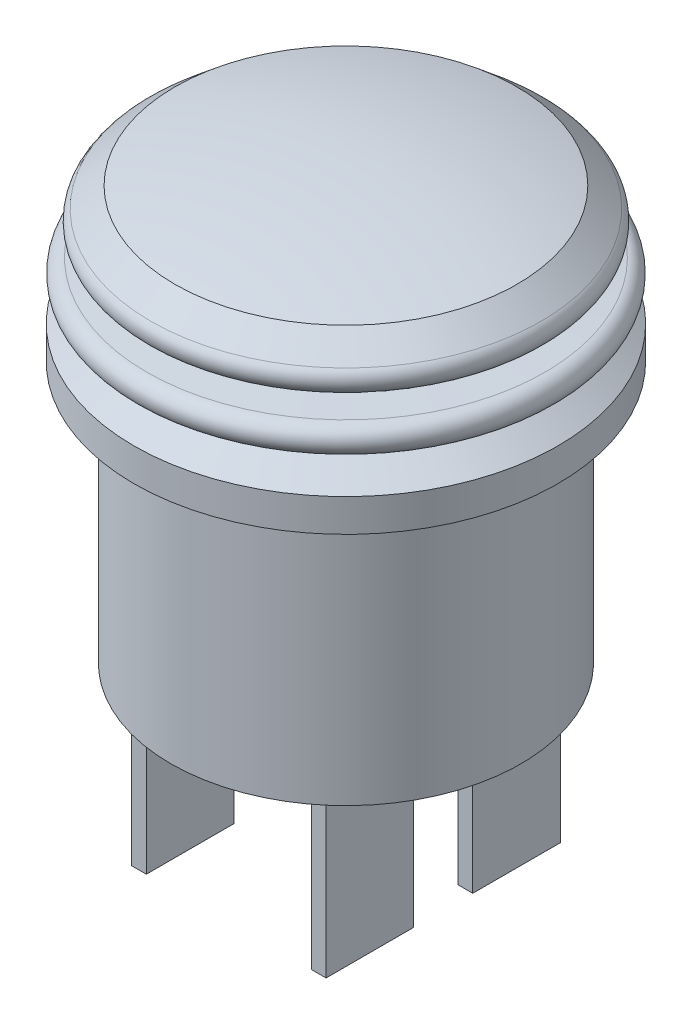
ISO-10303-21;
HEADER;
FILE_DESCRIPTION(('STEP AP214'),'2;1');
FILE_NAME('part.step','',(''),(''),'','','');
FILE_SCHEMA(('AUTOMOTIVE_DESIGN { 1 0 10303 214 1 1 1 1 }'));
ENDSEC;
DATA;
#1=APPLICATION_CONTEXT('core data for automotive mechanical design processes');
#2=APPLICATION_PROTOCOL_DEFINITION('international standard','automotive_design',2000,#1);
#3=PRODUCT_CONTEXT('',#1,'mechanical');
#4=PRODUCT('Part','Part','',(#3));
#5=PRODUCT_RELATED_PRODUCT_CATEGORY('part','',(#4));
#6=PRODUCT_DEFINITION_FORMATION('','',#4);
#7=PRODUCT_DEFINITION_CONTEXT('part definition',#1,'design');
#8=PRODUCT_DEFINITION('design','',#6,#7);
#9=PRODUCT_DEFINITION_SHAPE('','',#8);
#10=(LENGTH_UNIT() NAMED_UNIT(*) SI_UNIT(.MILLI.,.METRE.));
#11=(NAMED_UNIT(*) PLANE_ANGLE_UNIT() SI_UNIT($,.RADIAN.));
#12=(NAMED_UNIT(*) SI_UNIT($,.STERADIAN.) SOLID_ANGLE_UNIT());
#13=UNCERTAINTY_MEASURE_WITH_UNIT(LENGTH_MEASURE(1.E-05),#10,'distance_accuracy_value','');
#14=(GEOMETRIC_REPRESENTATION_CONTEXT(3) GLOBAL_UNCERTAINTY_ASSIGNED_CONTEXT((#13)) GLOBAL_UNIT_ASSIGNED_CONTEXT((#10,
#11,#12)) REPRESENTATION_CONTEXT('',''));
#15=CARTESIAN_POINT('',(0.,0.,0.));
#16=DIRECTION('',(0.,0.,1.));
#17=DIRECTION('',(1.,0.,0.));
#18=AXIS2_PLACEMENT_3D('',#15,#16,#17);
#19=CARTESIAN_POINT('',(0.,-13.2420041901718,0.));
#20=DIRECTION('',(0.,-1.,0.));
#21=DIRECTION('',(0.,0.,-1.));
#22=AXIS2_PLACEMENT_3D('',#19,#20,#21);
#23=PLANE('',#22);
#24=DIRECTION('',(-1.,0.,0.));
#25=VECTOR('',#24,1.);
#26=CARTESIAN_POINT('',(4.47592786310143,-13.2420041901718,-1.60451168270738));
#27=LINE('',#26,#25);
#28=CARTESIAN_POINT('',(5.27592786310143,-13.2420041901718,-1.60451168270738));
#29=VERTEX_POINT('',#28);
#30=CARTESIAN_POINT('',(4.47592786310143,-13.2420041901718,-1.60451168270738));
#31=VERTEX_POINT('',#30);
#32=EDGE_CURVE('E174',#29,#31,#27,.T.);
#33=ORIENTED_EDGE('',*,*,#32,.F.);
#34=DIRECTION('',(0.,0.,1.));
#35=VECTOR('',#34,1.);
#36=CARTESIAN_POINT('',(5.27592786310143,-13.2420041901718,-1.60451168270738));
#37=LINE('',#36,#35);
#38=CARTESIAN_POINT('',(5.27592786310143,-13.2420041901718,-6.35451168270738));
#39=VERTEX_POINT('',#38);
#40=EDGE_CURVE('E171',#39,#29,#37,.T.);
#41=ORIENTED_EDGE('',*,*,#40,.F.);
#42=DIRECTION('',(1.,0.,0.));
#43=VECTOR('',#42,1.);
#44=CARTESIAN_POINT('',(4.47592786310143,-13.2420041901718,-6.35451168270738));
#45=LINE('',#44,#43);
#46=CARTESIAN_POINT('',(4.47592786310143,-13.2420041901718,-6.35451168270738));
#47=VERTEX_POINT('',#46);
#48=EDGE_CURVE('E183',#47,#39,#45,.T.);
#49=ORIENTED_EDGE('',*,*,#48,.F.);
#50=DIRECTION('',(0.,0.,-1.));
#51=VECTOR('',#50,1.);
#52=CARTESIAN_POINT('',(4.47592786310143,-13.2420041901718,-1.60451168270738));
#53=LINE('',#52,#51);
#54=EDGE_CURVE('E191',#31,#47,#53,.T.);
#55=ORIENTED_EDGE('',*,*,#54,.F.);
#56=EDGE_LOOP('',(#33,#41,#49,#55));
#57=FACE_BOUND('',#56,.T.);
#58=DIRECTION('',(-1.,0.,0.));
#59=VECTOR('',#58,1.);
#60=CARTESIAN_POINT('',(-5.27592786310143,-13.2420041901718,6.35451168270738));
#61=LINE('',#60,#59);
#62=CARTESIAN_POINT('',(-4.47592786310143,-13.2420041901718,6.35451168270738));
#63=VERTEX_POINT('',#62);
#64=CARTESIAN_POINT('',(-5.27592786310143,-13.2420041901718,6.35451168270738));
#65=VERTEX_POINT('',#64);
#66=EDGE_CURVE('E245',#63,#65,#61,.T.);
#67=ORIENTED_EDGE('',*,*,#66,.F.);
#68=DIRECTION('',(0.,0.,1.));
#69=VECTOR('',#68,1.);
#70=CARTESIAN_POINT('',(-4.47592786310143,-13.2420041901718,6.35451168270738));
#71=LINE('',#70,#69);
#72=CARTESIAN_POINT('',(-4.47592786310143,-13.2420041901718,1.60451168270738));
#73=VERTEX_POINT('',#72);
#74=EDGE_CURVE('E231',#73,#63,#71,.T.);
#75=ORIENTED_EDGE('',*,*,#74,.F.);
#76=DIRECTION('',(1.,0.,0.));
#77=VECTOR('',#76,1.);
#78=CARTESIAN_POINT('',(-5.27592786310143,-13.2420041901718,1.60451168270738));
#79=LINE('',#78,#77);
#80=CARTESIAN_POINT('',(-5.27592786310143,-13.2420041901718,1.60451168270738));
#81=VERTEX_POINT('',#80);
#82=EDGE_CURVE('E236',#81,#73,#79,.T.);
#83=ORIENTED_EDGE('',*,*,#82,.F.);
#84=DIRECTION('',(0.,0.,-1.));
#85=VECTOR('',#84,1.);
#86=CARTESIAN_POINT('',(-5.27592786310143,-13.2420041901718,6.35451168270738));
#87=LINE('',#86,#85);
#88=EDGE_CURVE('E247',#65,#81,#87,.T.);
#89=ORIENTED_EDGE('',*,*,#88,.F.);
#90=EDGE_LOOP('',(#67,#75,#83,#89));
#91=FACE_BOUND('',#90,.T.);
#92=CARTESIAN_POINT('',(0.,-13.2420041901718,0.));
#93=DIRECTION('',(0.,1.,0.));
#94=DIRECTION('',(0.,0.,1.));
#95=AXIS2_PLACEMENT_3D('',#92,#93,#94);
#96=CIRCLE('',#95,9.49999999999999);
#97=CARTESIAN_POINT('',(0.,-13.2420041901718,9.49999999999999));
#98=VERTEX_POINT('',#97);
#99=EDGE_CURVE('E11',#98,#98,#96,.T.);
#100=ORIENTED_EDGE('',*,*,#99,.F.);
#101=EDGE_LOOP('',(#100));
#102=FACE_BOUND('',#101,.T.);
#103=DIRECTION('',(-1.,0.,0.));
#104=VECTOR('',#103,1.);
#105=CARTESIAN_POINT('',(4.47592786310143,-13.2420041901718,6.35451168270738));
#106=LINE('',#105,#104);
#107=CARTESIAN_POINT('',(5.27592786310143,-13.2420041901718,6.35451168270738));
#108=VERTEX_POINT('',#107);
#109=CARTESIAN_POINT('',(4.47592786310143,-13.2420041901718,6.35451168270738));
#110=VERTEX_POINT('',#109);
#111=EDGE_CURVE('E216',#108,#110,#106,.T.);
#112=ORIENTED_EDGE('',*,*,#111,.F.);
#113=DIRECTION('',(0.,0.,1.));
#114=VECTOR('',#113,1.);
#115=CARTESIAN_POINT('',(5.27592786310143,-13.2420041901718,6.35451168270738));
#116=LINE('',#115,#114);
#117=CARTESIAN_POINT('',(5.27592786310143,-13.2420041901718,1.60451168270738));
#118=VERTEX_POINT('',#117);
#119=EDGE_CURVE('E202',#118,#108,#116,.T.);
#120=ORIENTED_EDGE('',*,*,#119,.F.);
#121=DIRECTION('',(1.,0.,0.));
#122=VECTOR('',#121,1.);
#123=CARTESIAN_POINT('',(4.47592786310143,-13.2420041901718,1.60451168270738));
#124=LINE('',#123,#122);
#125=CARTESIAN_POINT('',(4.47592786310143,-13.2420041901718,1.60451168270738));
#126=VERTEX_POINT('',#125);
#127=EDGE_CURVE('E207',#126,#118,#124,.T.);
#128=ORIENTED_EDGE('',*,*,#127,.F.);
#129=DIRECTION('',(0.,0.,-1.));
#130=VECTOR('',#129,1.);
#131=CARTESIAN_POINT('',(4.47592786310143,-13.2420041901718,6.35451168270738));
#132=LINE('',#131,#130);
#133=EDGE_CURVE('E218',#110,#126,#132,.T.);
#134=ORIENTED_EDGE('',*,*,#133,.F.);
#135=EDGE_LOOP('',(#112,#120,#128,#134));
#136=FACE_BOUND('',#135,.T.);
#137=DIRECTION('',(-1.,0.,0.));
#138=VECTOR('',#137,1.);
#139=CARTESIAN_POINT('',(-5.27592786310143,-13.2420041901718,-1.60451168270737));
#140=LINE('',#139,#138);
#141=CARTESIAN_POINT('',(-4.47592786310143,-13.2420041901718,-1.60451168270737));
#142=VERTEX_POINT('',#141);
#143=CARTESIAN_POINT('',(-5.27592786310143,-13.2420041901718,-1.60451168270737));
#144=VERTEX_POINT('',#143);
#145=EDGE_CURVE('E619',#142,#144,#140,.T.);
#146=ORIENTED_EDGE('',*,*,#145,.F.);
#147=DIRECTION('',(0.,0.,1.));
#148=VECTOR('',#147,1.);
#149=CARTESIAN_POINT('',(-4.47592786310143,-13.2420041901718,-1.60451168270737));
#150=LINE('',#149,#148);
#151=CARTESIAN_POINT('',(-4.47592786310143,-13.2420041901718,-6.35451168270738));
#152=VERTEX_POINT('',#151);
#153=EDGE_CURVE('E169',#152,#142,#150,.T.);
#154=ORIENTED_EDGE('',*,*,#153,.F.);
#155=DIRECTION('',(1.,0.,0.));
#156=VECTOR('',#155,1.);
#157=CARTESIAN_POINT('',(-5.27592786310143,-13.2420041901718,-6.35451168270738));
#158=LINE('',#157,#156);
#159=CARTESIAN_POINT('',(-5.27592786310143,-13.2420041901718,-6.35451168270738));
#160=VERTEX_POINT('',#159);
#161=EDGE_CURVE('E165',#160,#152,#158,.T.);
#162=ORIENTED_EDGE('',*,*,#161,.F.);
#163=DIRECTION('',(0.,0.,-1.));
#164=VECTOR('',#163,1.);
#165=CARTESIAN_POINT('',(-5.27592786310143,-13.2420041901718,-1.60451168270737));
#166=LINE('',#165,#164);
#167=EDGE_CURVE('E616',#144,#160,#166,.T.);
#168=ORIENTED_EDGE('',*,*,#167,.F.);
#169=EDGE_LOOP('',(#146,#154,#162,#168));
#170=FACE_BOUND('',#169,.T.);
#171=ADVANCED_FACE('F33',(#57,#91,#102,#136,#170),#23,.T.);
#172=CARTESIAN_POINT('',(0.,40.4284122104452,0.));
#173=DIRECTION('',(0.,1.,0.));
#174=DIRECTION('',(0.,0.,1.));
#175=AXIS2_PLACEMENT_3D('',#172,#173,#174);
#176=CYLINDRICAL_SURFACE('',#175,9.49999999999999);
#177=ORIENTED_EDGE('',*,*,#99,.T.);
#178=EDGE_LOOP('',(#177));
#179=FACE_BOUND('',#178,.T.);
#180=CARTESIAN_POINT('',(0.,0.918065199617131,0.));
#181=DIRECTION('',(0.,1.,0.));
#182=DIRECTION('',(0.,0.,1.));
#183=AXIS2_PLACEMENT_3D('',#180,#181,#182);
#184=CIRCLE('',#183,9.49999999999999);
#185=CARTESIAN_POINT('',(0.,0.918065199617131,9.49999999999999));
#186=VERTEX_POINT('',#185);
#187=EDGE_CURVE('E40',#186,#186,#184,.T.);
#188=ORIENTED_EDGE('',*,*,#187,.F.);
#189=EDGE_LOOP('',(#188));
#190=FACE_BOUND('',#189,.T.);
#191=ADVANCED_FACE('F295',(#179,#190),#176,.T.);
#192=CARTESIAN_POINT('',(-9.49999999999999,0.918065199617134,0.));
#193=DIRECTION('',(0.,-1.,0.));
#194=DIRECTION('',(0.,0.,-1.));
#195=AXIS2_PLACEMENT_3D('',#192,#193,#194);
#196=PLANE('',#195);
#197=ORIENTED_EDGE('',*,*,#187,.T.);
#198=EDGE_LOOP('',(#197));
#199=FACE_BOUND('',#198,.T.);
#200=CARTESIAN_POINT('',(0.,0.918065199617131,0.));
#201=DIRECTION('',(0.,1.,0.));
#202=DIRECTION('',(0.,0.,1.));
#203=AXIS2_PLACEMENT_3D('',#200,#201,#202);
#204=CIRCLE('',#203,11.5);
#205=CARTESIAN_POINT('',(0.,0.918065199617131,11.5));
#206=VERTEX_POINT('',#205);
#207=EDGE_CURVE('E287',#206,#206,#204,.T.);
#208=ORIENTED_EDGE('',*,*,#207,.F.);
#209=EDGE_LOOP('',(#208));
#210=FACE_BOUND('',#209,.T.);
#211=ADVANCED_FACE('F292',(#199,#210),#196,.T.);
#212=CARTESIAN_POINT('',(0.,40.4284122104452,0.));
#213=DIRECTION('',(0.,1.,0.));
#214=DIRECTION('',(0.,0.,1.));
#215=AXIS2_PLACEMENT_3D('',#212,#213,#214);
#216=CYLINDRICAL_SURFACE('',#215,11.5);
#217=ORIENTED_EDGE('',*,*,#207,.T.);
#218=EDGE_LOOP('',(#217));
#219=FACE_BOUND('',#218,.T.);
#220=CARTESIAN_POINT('',(0.,2.69389815011813,0.));
#221=DIRECTION('',(0.,1.,0.));
#222=DIRECTION('',(0.,0.,1.));
#223=AXIS2_PLACEMENT_3D('',#220,#221,#222);
#224=CIRCLE('',#223,11.5);
#225=CARTESIAN_POINT('',(0.,2.69389815011813,11.5));
#226=VERTEX_POINT('',#225);
#227=EDGE_CURVE('E284',#226,#226,#224,.T.);
#228=ORIENTED_EDGE('',*,*,#227,.F.);
#229=EDGE_LOOP('',(#228));
#230=FACE_BOUND('',#229,.T.);
#231=ADVANCED_FACE('F302',(#219,#230),#216,.T.);
#232=CARTESIAN_POINT('',(0.,3.99115987010987,0.));
#233=DIRECTION('',(0.,-1.,0.));
#234=DIRECTION('',(0.,0.,-1.));
#235=AXIS2_PLACEMENT_3D('',#232,#233,#234);
#236=CONICAL_SURFACE('',#235,9.59273848976282,0.973503553018056);
#237=ORIENTED_EDGE('',*,*,#227,.T.);
#238=EDGE_LOOP('',(#237));
#239=FACE_BOUND('',#238,.T.);
#240=CARTESIAN_POINT('',(0.,3.99115987010987,0.));
#241=DIRECTION('',(0.,1.,0.));
#242=DIRECTION('',(0.,0.,1.));
#243=AXIS2_PLACEMENT_3D('',#240,#241,#242);
#244=CIRCLE('',#243,9.59273848976282);
#245=CARTESIAN_POINT('',(0.,3.99115987010987,9.59273848976282));
#246=VERTEX_POINT('',#245);
#247=EDGE_CURVE('E281',#246,#246,#244,.T.);
#248=ORIENTED_EDGE('',*,*,#247,.F.);
#249=EDGE_LOOP('',(#248));
#250=FACE_BOUND('',#249,.T.);
#251=ADVANCED_FACE('F308',(#239,#250),#236,.T.);
#252=CARTESIAN_POINT('',(0.,4.33219813604537,0.));
#253=DIRECTION('',(0.,1.,0.));
#254=DIRECTION('',(0.,0.,1.));
#255=AXIS2_PLACEMENT_3D('',#252,#253,#254);
#256=CONICAL_SURFACE('',#255,10.9210992908884,1.31948785521805);
#257=ORIENTED_EDGE('',*,*,#247,.T.);
#258=EDGE_LOOP('',(#257));
#259=FACE_BOUND('',#258,.T.);
#260=CARTESIAN_POINT('',(0.,4.33219813604537,0.));
#261=DIRECTION('',(0.,1.,0.));
#262=DIRECTION('',(0.,0.,1.));
#263=AXIS2_PLACEMENT_3D('',#260,#261,#262);
#264=CIRCLE('',#263,10.9210992908884);
#265=CARTESIAN_POINT('',(0.,4.33219813604537,10.9210992908884));
#266=VERTEX_POINT('',#265);
#267=EDGE_CURVE('E278',#266,#266,#264,.T.);
#268=ORIENTED_EDGE('',*,*,#267,.F.);
#269=EDGE_LOOP('',(#268));
#270=FACE_BOUND('',#269,.T.);
#271=ADVANCED_FACE('F312',(#259,#270),#256,.T.);
#272=CARTESIAN_POINT('',(0.,5.05863903953387,0.));
#273=DIRECTION('',(0.,1.,0.));
#274=DIRECTION('',(0.,0.,1.));
#275=AXIS2_PLACEMENT_3D('',#272,#273,#274);
#276=TOROIDAL_SURFACE('',#275,10.734595634788,0.75);
#277=ORIENTED_EDGE('',*,*,#267,.T.);
#278=EDGE_LOOP('',(#277));
#279=FACE_BOUND('',#278,.T.);
#280=CARTESIAN_POINT('',(0.,5.8057648186217,0.));
#281=DIRECTION('',(0.,1.,0.));
#282=DIRECTION('',(0.,0.,1.));
#283=AXIS2_PLACEMENT_3D('',#280,#281,#282);
#284=CIRCLE('',#283,10.8001934260801);
#285=CARTESIAN_POINT('',(0.,5.8057648186217,10.8001934260801));
#286=VERTEX_POINT('',#285);
#287=EDGE_CURVE('E275',#286,#286,#284,.T.);
#288=ORIENTED_EDGE('',*,*,#287,.F.);
#289=EDGE_LOOP('',(#288));
#290=FACE_BOUND('',#289,.T.);
#291=ADVANCED_FACE('F316',(#279,#290),#276,.T.);
#292=CARTESIAN_POINT('',(0.,6.02546041252507,0.));
#293=DIRECTION('',(0.,-1.,0.));
#294=DIRECTION('',(0.,0.,-1.));
#295=AXIS2_PLACEMENT_3D('',#292,#293,#294);
#296=CONICAL_SURFACE('',#295,8.29797134627988,1.48322070460439);
#297=ORIENTED_EDGE('',*,*,#287,.T.);
#298=EDGE_LOOP('',(#297));
#299=FACE_BOUND('',#298,.T.);
#300=CARTESIAN_POINT('',(0.,6.02546041252507,0.));
#301=DIRECTION('',(0.,1.,0.));
#302=DIRECTION('',(0.,0.,1.));
#303=AXIS2_PLACEMENT_3D('',#300,#301,#302);
#304=CIRCLE('',#303,8.29797134627988);
#305=CARTESIAN_POINT('',(0.,6.02546041252507,8.29797134627988));
#306=VERTEX_POINT('',#305);
#307=EDGE_CURVE('E272',#306,#306,#304,.T.);
#308=ORIENTED_EDGE('',*,*,#307,.F.);
#309=EDGE_LOOP('',(#308));
#310=FACE_BOUND('',#309,.T.);
#311=ADVANCED_FACE('F320',(#299,#310),#296,.T.);
#312=CARTESIAN_POINT('',(0.,40.4284122104452,0.));
#313=DIRECTION('',(0.,1.,0.));
#314=DIRECTION('',(0.,0.,1.));
#315=AXIS2_PLACEMENT_3D('',#312,#313,#314);
#316=CYLINDRICAL_SURFACE('',#315,8.29797134627988);
#317=ORIENTED_EDGE('',*,*,#307,.T.);
#318=EDGE_LOOP('',(#317));
#319=FACE_BOUND('',#318,.T.);
#320=CARTESIAN_POINT('',(0.,6.18417124200543,0.));
#321=DIRECTION('',(0.,1.,0.));
#322=DIRECTION('',(0.,0.,1.));
#323=AXIS2_PLACEMENT_3D('',#320,#321,#322);
#324=CIRCLE('',#323,8.29797134627988);
#325=CARTESIAN_POINT('',(0.,6.18417124200543,8.29797134627988));
#326=VERTEX_POINT('',#325);
#327=EDGE_CURVE('E269',#326,#326,#324,.T.);
#328=ORIENTED_EDGE('',*,*,#327,.F.);
#329=EDGE_LOOP('',(#328));
#330=FACE_BOUND('',#329,.T.);
#331=ADVANCED_FACE('F324',(#319,#330),#316,.T.);
#332=CARTESIAN_POINT('',(0.,6.79438190096943,0.));
#333=DIRECTION('',(0.,1.,0.));
#334=DIRECTION('',(0.,0.,1.));
#335=AXIS2_PLACEMENT_3D('',#332,#333,#334);
#336=CONICAL_SURFACE('',#335,10.3168636956257,1.27727638997949);
#337=ORIENTED_EDGE('',*,*,#327,.T.);
#338=EDGE_LOOP('',(#337));
#339=FACE_BOUND('',#338,.T.);
#340=CARTESIAN_POINT('',(0.,6.79438190096943,0.));
#341=DIRECTION('',(0.,1.,0.));
#342=DIRECTION('',(0.,0.,1.));
#343=AXIS2_PLACEMENT_3D('',#340,#341,#342);
#344=CIRCLE('',#343,10.3168636956257);
#345=CARTESIAN_POINT('',(0.,6.79438190096943,10.3168636956257));
#346=VERTEX_POINT('',#345);
#347=EDGE_CURVE('E266',#346,#346,#344,.T.);
#348=ORIENTED_EDGE('',*,*,#347,.F.);
#349=EDGE_LOOP('',(#348));
#350=FACE_BOUND('',#349,.T.);
#351=ADVANCED_FACE('F328',(#339,#350),#336,.T.);
#352=CARTESIAN_POINT('',(0.,7.51230545661946,0.));
#353=DIRECTION('',(0.,1.,0.));
#354=DIRECTION('',(0.,0.,1.));
#355=AXIS2_PLACEMENT_3D('',#352,#353,#354);
#356=TOROIDAL_SURFACE('',#355,10.0998711421986,0.75);
#357=ORIENTED_EDGE('',*,*,#347,.T.);
#358=EDGE_LOOP('',(#357));
#359=FACE_BOUND('',#358,.T.);
#360=CARTESIAN_POINT('',(0.,8.08722952749193,0.));
#361=DIRECTION('',(0.,1.,0.));
#362=DIRECTION('',(0.,0.,1.));
#363=AXIS2_PLACEMENT_3D('',#360,#361,#362);
#364=CIRCLE('',#363,10.5814958017951);
#365=CARTESIAN_POINT('',(0.,8.08722952749193,10.5814958017951));
#366=VERTEX_POINT('',#365);
#367=EDGE_CURVE('E263',#366,#366,#364,.T.);
#368=ORIENTED_EDGE('',*,*,#367,.F.);
#369=EDGE_LOOP('',(#368));
#370=FACE_BOUND('',#369,.T.);
#371=ADVANCED_FACE('F332',(#359,#370),#356,.T.);
#372=CARTESIAN_POINT('',(0.,9.17683088267281,0.));
#373=DIRECTION('',(0.,-1.,0.));
#374=DIRECTION('',(0.,0.,-1.));
#375=AXIS2_PLACEMENT_3D('',#372,#373,#374);
#376=CONICAL_SURFACE('',#375,9.28081894842634,0.873475526238588);
#377=ORIENTED_EDGE('',*,*,#367,.T.);
#378=EDGE_LOOP('',(#377));
#379=FACE_BOUND('',#378,.T.);
#380=CARTESIAN_POINT('',(0.,9.17683088267281,0.));
#381=DIRECTION('',(0.,1.,0.));
#382=DIRECTION('',(0.,0.,1.));
#383=AXIS2_PLACEMENT_3D('',#380,#381,#382);
#384=CIRCLE('',#383,9.28081894842634);
#385=CARTESIAN_POINT('',(0.,9.17683088267281,9.28081894842634));
#386=VERTEX_POINT('',#385);
#387=EDGE_CURVE('E260',#386,#386,#384,.T.);
#388=ORIENTED_EDGE('',*,*,#387,.F.);
#389=EDGE_LOOP('',(#388));
#390=FACE_BOUND('',#389,.T.);
#391=ADVANCED_FACE('F336',(#379,#390),#376,.T.);
#392=CARTESIAN_POINT('',(0.,-24.8993046902467,0.));
#393=DIRECTION('',(0.,1.,0.));
#394=DIRECTION('',(-1.,0.,0.));
#395=AXIS2_PLACEMENT_3D('',#392,#393,#394);
#396=SPHERICAL_SURFACE('',#395,35.3173698898638);
#397=ORIENTED_EDGE('',*,*,#387,.T.);
#398=EDGE_LOOP('',(#397));
#399=FACE_BOUND('',#398,.T.);
#400=ADVANCED_FACE('F340',(#399),#396,.T.);
#401=CARTESIAN_POINT('',(-4.47592786310143,-22.2420041901718,6.35451168270738));
#402=DIRECTION('',(-1.,0.,0.));
#403=DIRECTION('',(0.,0.,1.));
#404=AXIS2_PLACEMENT_3D('',#401,#402,#403);
#405=PLANE('',#404);
#406=ORIENTED_EDGE('',*,*,#74,.T.);
#407=DIRECTION('',(0.,1.,0.));
#408=VECTOR('',#407,1.);
#409=CARTESIAN_POINT('',(-4.47592786310143,-22.2420041901718,6.35451168270738));
#410=LINE('',#409,#408);
#411=CARTESIAN_POINT('',(-4.47592786310143,-22.2420041901718,6.35451168270738));
#412=VERTEX_POINT('',#411);
#413=EDGE_CURVE('E258',#412,#63,#410,.T.);
#414=ORIENTED_EDGE('',*,*,#413,.F.);
#415=DIRECTION('',(0.,0.,1.));
#416=VECTOR('',#415,1.);
#417=CARTESIAN_POINT('',(-4.47592786310143,-22.2420041901718,6.35451168270738));
#418=LINE('',#417,#416);
#419=CARTESIAN_POINT('',(-4.47592786310143,-22.2420041901718,1.60451168270738));
#420=VERTEX_POINT('',#419);
#421=EDGE_CURVE('E232',#420,#412,#418,.T.);
#422=ORIENTED_EDGE('',*,*,#421,.F.);
#423=DIRECTION('',(0.,1.,0.));
#424=VECTOR('',#423,1.);
#425=CARTESIAN_POINT('',(-4.47592786310143,-22.2420041901718,1.60451168270738));
#426=LINE('',#425,#424);
#427=EDGE_CURVE('E242',#420,#73,#426,.T.);
#428=ORIENTED_EDGE('',*,*,#427,.T.);
#429=EDGE_LOOP('',(#406,#414,#422,#428));
#430=FACE_BOUND('',#429,.T.);
#431=ADVANCED_FACE('F344',(#430),#405,.F.);
#432=CARTESIAN_POINT('',(-5.27592786310143,-22.2420041901718,6.35451168270738));
#433=DIRECTION('',(0.,0.,-1.));
#434=DIRECTION('',(-1.,0.,0.));
#435=AXIS2_PLACEMENT_3D('',#432,#433,#434);
#436=PLANE('',#435);
#437=ORIENTED_EDGE('',*,*,#66,.T.);
#438=DIRECTION('',(0.,1.,0.));
#439=VECTOR('',#438,1.);
#440=CARTESIAN_POINT('',(-5.27592786310143,-22.2420041901718,6.35451168270738));
#441=LINE('',#440,#439);
#442=CARTESIAN_POINT('',(-5.27592786310143,-22.2420041901718,6.35451168270738));
#443=VERTEX_POINT('',#442);
#444=EDGE_CURVE('E255',#443,#65,#441,.T.);
#445=ORIENTED_EDGE('',*,*,#444,.F.);
#446=DIRECTION('',(-1.,0.,0.));
#447=VECTOR('',#446,1.);
#448=CARTESIAN_POINT('',(-5.27592786310143,-22.2420041901718,6.35451168270738));
#449=LINE('',#448,#447);
#450=EDGE_CURVE('E235',#412,#443,#449,.T.);
#451=ORIENTED_EDGE('',*,*,#450,.F.);
#452=ORIENTED_EDGE('',*,*,#413,.T.);
#453=EDGE_LOOP('',(#437,#445,#451,#452));
#454=FACE_BOUND('',#453,.T.);
#455=ADVANCED_FACE('F348',(#454),#436,.F.);
#456=CARTESIAN_POINT('',(-5.27592786310143,-22.2420041901718,6.35451168270738));
#457=DIRECTION('',(1.,0.,0.));
#458=DIRECTION('',(0.,0.,-1.));
#459=AXIS2_PLACEMENT_3D('',#456,#457,#458);
#460=PLANE('',#459);
#461=ORIENTED_EDGE('',*,*,#88,.T.);
#462=DIRECTION('',(0.,1.,0.));
#463=VECTOR('',#462,1.);
#464=CARTESIAN_POINT('',(-5.27592786310143,-22.2420041901718,1.60451168270738));
#465=LINE('',#464,#463);
#466=CARTESIAN_POINT('',(-5.27592786310143,-22.2420041901718,1.60451168270738));
#467=VERTEX_POINT('',#466);
#468=EDGE_CURVE('E253',#467,#81,#465,.T.);
#469=ORIENTED_EDGE('',*,*,#468,.F.);
#470=DIRECTION('',(0.,0.,-1.));
#471=VECTOR('',#470,1.);
#472=CARTESIAN_POINT('',(-5.27592786310143,-22.2420041901718,6.35451168270738));
#473=LINE('',#472,#471);
#474=EDGE_CURVE('E238',#443,#467,#473,.T.);
#475=ORIENTED_EDGE('',*,*,#474,.F.);
#476=ORIENTED_EDGE('',*,*,#444,.T.);
#477=EDGE_LOOP('',(#461,#469,#475,#476));
#478=FACE_BOUND('',#477,.T.);
#479=ADVANCED_FACE('F352',(#478),#460,.F.);
#480=CARTESIAN_POINT('',(-5.27592786310143,-22.2420041901718,1.60451168270738));
#481=DIRECTION('',(0.,0.,1.));
#482=DIRECTION('',(1.,0.,0.));
#483=AXIS2_PLACEMENT_3D('',#480,#481,#482);
#484=PLANE('',#483);
#485=ORIENTED_EDGE('',*,*,#82,.T.);
#486=ORIENTED_EDGE('',*,*,#427,.F.);
#487=DIRECTION('',(1.,0.,0.));
#488=VECTOR('',#487,1.);
#489=CARTESIAN_POINT('',(-5.27592786310143,-22.2420041901718,1.60451168270738));
#490=LINE('',#489,#488);
#491=EDGE_CURVE('E240',#467,#420,#490,.T.);
#492=ORIENTED_EDGE('',*,*,#491,.F.);
#493=ORIENTED_EDGE('',*,*,#468,.T.);
#494=EDGE_LOOP('',(#485,#486,#492,#493));
#495=FACE_BOUND('',#494,.T.);
#496=ADVANCED_FACE('F356',(#495),#484,.F.);
#497=CARTESIAN_POINT('',(0.,-22.2420041901718,0.));
#498=DIRECTION('',(0.,-1.,0.));
#499=DIRECTION('',(0.,0.,-1.));
#500=AXIS2_PLACEMENT_3D('',#497,#498,#499);
#501=PLANE('',#500);
#502=ORIENTED_EDGE('',*,*,#421,.T.);
#503=ORIENTED_EDGE('',*,*,#450,.T.);
#504=ORIENTED_EDGE('',*,*,#474,.T.);
#505=ORIENTED_EDGE('',*,*,#491,.T.);
#506=EDGE_LOOP('',(#502,#503,#504,#505));
#507=FACE_BOUND('',#506,.T.);
#508=ADVANCED_FACE('F360',(#507),#501,.T.);
#509=CARTESIAN_POINT('',(5.27592786310143,-22.2420041901718,6.35451168270738));
#510=DIRECTION('',(-1.,0.,0.));
#511=DIRECTION('',(0.,0.,1.));
#512=AXIS2_PLACEMENT_3D('',#509,#510,#511);
#513=PLANE('',#512);
#514=ORIENTED_EDGE('',*,*,#119,.T.);
#515=DIRECTION('',(0.,1.,0.));
#516=VECTOR('',#515,1.);
#517=CARTESIAN_POINT('',(5.27592786310143,-22.2420041901718,6.35451168270738));
#518=LINE('',#517,#516);
#519=CARTESIAN_POINT('',(5.27592786310143,-22.2420041901718,6.35451168270738));
#520=VERTEX_POINT('',#519);
#521=EDGE_CURVE('E229',#520,#108,#518,.T.);
#522=ORIENTED_EDGE('',*,*,#521,.F.);
#523=DIRECTION('',(0.,0.,1.));
#524=VECTOR('',#523,1.);
#525=CARTESIAN_POINT('',(5.27592786310143,-22.2420041901718,6.35451168270738));
#526=LINE('',#525,#524);
#527=CARTESIAN_POINT('',(5.27592786310143,-22.2420041901718,1.60451168270738));
#528=VERTEX_POINT('',#527);
#529=EDGE_CURVE('E203',#528,#520,#526,.T.);
#530=ORIENTED_EDGE('',*,*,#529,.F.);
#531=DIRECTION('',(0.,1.,0.));
#532=VECTOR('',#531,1.);
#533=CARTESIAN_POINT('',(5.27592786310143,-22.2420041901718,1.60451168270738));
#534=LINE('',#533,#532);
#535=EDGE_CURVE('E213',#528,#118,#534,.T.);
#536=ORIENTED_EDGE('',*,*,#535,.T.);
#537=EDGE_LOOP('',(#514,#522,#530,#536));
#538=FACE_BOUND('',#537,.T.);
#539=ADVANCED_FACE('F364',(#538),#513,.F.);
#540=CARTESIAN_POINT('',(4.47592786310143,-22.2420041901718,6.35451168270738));
#541=DIRECTION('',(0.,0.,-1.));
#542=DIRECTION('',(-1.,0.,0.));
#543=AXIS2_PLACEMENT_3D('',#540,#541,#542);
#544=PLANE('',#543);
#545=ORIENTED_EDGE('',*,*,#111,.T.);
#546=DIRECTION('',(0.,1.,0.));
#547=VECTOR('',#546,1.);
#548=CARTESIAN_POINT('',(4.47592786310143,-22.2420041901718,6.35451168270738));
#549=LINE('',#548,#547);
#550=CARTESIAN_POINT('',(4.47592786310143,-22.2420041901718,6.35451168270738));
#551=VERTEX_POINT('',#550);
#552=EDGE_CURVE('E226',#551,#110,#549,.T.);
#553=ORIENTED_EDGE('',*,*,#552,.F.);
#554=DIRECTION('',(-1.,0.,0.));
#555=VECTOR('',#554,1.);
#556=CARTESIAN_POINT('',(4.47592786310143,-22.2420041901718,6.35451168270738));
#557=LINE('',#556,#555);
#558=EDGE_CURVE('E206',#520,#551,#557,.T.);
#559=ORIENTED_EDGE('',*,*,#558,.F.);
#560=ORIENTED_EDGE('',*,*,#521,.T.);
#561=EDGE_LOOP('',(#545,#553,#559,#560));
#562=FACE_BOUND('',#561,.T.);
#563=ADVANCED_FACE('F368',(#562),#544,.F.);
#564=CARTESIAN_POINT('',(4.47592786310143,-22.2420041901718,6.35451168270738));
#565=DIRECTION('',(1.,0.,0.));
#566=DIRECTION('',(0.,0.,-1.));
#567=AXIS2_PLACEMENT_3D('',#564,#565,#566);
#568=PLANE('',#567);
#569=ORIENTED_EDGE('',*,*,#133,.T.);
#570=DIRECTION('',(0.,1.,0.));
#571=VECTOR('',#570,1.);
#572=CARTESIAN_POINT('',(4.47592786310143,-22.2420041901718,1.60451168270738));
#573=LINE('',#572,#571);
#574=CARTESIAN_POINT('',(4.47592786310143,-22.2420041901718,1.60451168270738));
#575=VERTEX_POINT('',#574);
#576=EDGE_CURVE('E224',#575,#126,#573,.T.);
#577=ORIENTED_EDGE('',*,*,#576,.F.);
#578=DIRECTION('',(0.,0.,-1.));
#579=VECTOR('',#578,1.);
#580=CARTESIAN_POINT('',(4.47592786310143,-22.2420041901718,6.35451168270738));
#581=LINE('',#580,#579);
#582=EDGE_CURVE('E209',#551,#575,#581,.T.);
#583=ORIENTED_EDGE('',*,*,#582,.F.);
#584=ORIENTED_EDGE('',*,*,#552,.T.);
#585=EDGE_LOOP('',(#569,#577,#583,#584));
#586=FACE_BOUND('',#585,.T.);
#587=ADVANCED_FACE('F372',(#586),#568,.F.);
#588=CARTESIAN_POINT('',(4.47592786310143,-22.2420041901718,1.60451168270738));
#589=DIRECTION('',(0.,0.,1.));
#590=DIRECTION('',(1.,0.,0.));
#591=AXIS2_PLACEMENT_3D('',#588,#589,#590);
#592=PLANE('',#591);
#593=ORIENTED_EDGE('',*,*,#127,.T.);
#594=ORIENTED_EDGE('',*,*,#535,.F.);
#595=DIRECTION('',(1.,0.,0.));
#596=VECTOR('',#595,1.);
#597=CARTESIAN_POINT('',(4.47592786310143,-22.2420041901718,1.60451168270738));
#598=LINE('',#597,#596);
#599=EDGE_CURVE('E211',#575,#528,#598,.T.);
#600=ORIENTED_EDGE('',*,*,#599,.F.);
#601=ORIENTED_EDGE('',*,*,#576,.T.);
#602=EDGE_LOOP('',(#593,#594,#600,#601));
#603=FACE_BOUND('',#602,.T.);
#604=ADVANCED_FACE('F376',(#603),#592,.F.);
#605=CARTESIAN_POINT('',(0.,-22.2420041901718,0.));
#606=DIRECTION('',(0.,-1.,0.));
#607=DIRECTION('',(0.,0.,-1.));
#608=AXIS2_PLACEMENT_3D('',#605,#606,#607);
#609=PLANE('',#608);
#610=ORIENTED_EDGE('',*,*,#529,.T.);
#611=ORIENTED_EDGE('',*,*,#558,.T.);
#612=ORIENTED_EDGE('',*,*,#582,.T.);
#613=ORIENTED_EDGE('',*,*,#599,.T.);
#614=EDGE_LOOP('',(#610,#611,#612,#613));
#615=FACE_BOUND('',#614,.T.);
#616=ADVANCED_FACE('F380',(#615),#609,.T.);
#617=CARTESIAN_POINT('',(5.27592786310143,-22.2420041901718,-1.60451168270738));
#618=DIRECTION('',(-1.,0.,0.));
#619=DIRECTION('',(0.,0.,1.));
#620=AXIS2_PLACEMENT_3D('',#617,#618,#619);
#621=PLANE('',#620);
#622=ORIENTED_EDGE('',*,*,#40,.T.);
#623=DIRECTION('',(0.,1.,0.));
#624=VECTOR('',#623,1.);
#625=CARTESIAN_POINT('',(5.27592786310143,-22.2420041901718,-1.60451168270738));
#626=LINE('',#625,#624);
#627=CARTESIAN_POINT('',(5.27592786310143,-22.2420041901718,-1.60451168270738));
#628=VERTEX_POINT('',#627);
#629=EDGE_CURVE('E200',#628,#29,#626,.T.);
#630=ORIENTED_EDGE('',*,*,#629,.F.);
#631=DIRECTION('',(0.,0.,1.));
#632=VECTOR('',#631,1.);
#633=CARTESIAN_POINT('',(5.27592786310143,-22.2420041901718,-1.60451168270738));
#634=LINE('',#633,#632);
#635=CARTESIAN_POINT('',(5.27592786310143,-22.2420041901718,-6.35451168270738));
#636=VERTEX_POINT('',#635);
#637=EDGE_CURVE('E179',#636,#628,#634,.T.);
#638=ORIENTED_EDGE('',*,*,#637,.F.);
#639=DIRECTION('',(0.,1.,0.));
#640=VECTOR('',#639,1.);
#641=CARTESIAN_POINT('',(5.27592786310143,-22.2420041901718,-6.35451168270738));
#642=LINE('',#641,#640);
#643=EDGE_CURVE('E188',#636,#39,#642,.T.);
#644=ORIENTED_EDGE('',*,*,#643,.T.);
#645=EDGE_LOOP('',(#622,#630,#638,#644));
#646=FACE_BOUND('',#645,.T.);
#647=ADVANCED_FACE('F384',(#646),#621,.F.);
#648=CARTESIAN_POINT('',(4.47592786310143,-22.2420041901718,-1.60451168270738));
#649=DIRECTION('',(0.,0.,-1.));
#650=DIRECTION('',(-1.,0.,0.));
#651=AXIS2_PLACEMENT_3D('',#648,#649,#650);
#652=PLANE('',#651);
#653=ORIENTED_EDGE('',*,*,#32,.T.);
#654=DIRECTION('',(0.,1.,0.));
#655=VECTOR('',#654,1.);
#656=CARTESIAN_POINT('',(4.47592786310143,-22.2420041901718,-1.60451168270738));
#657=LINE('',#656,#655);
#658=CARTESIAN_POINT('',(4.47592786310143,-22.2420041901718,-1.60451168270738));
#659=VERTEX_POINT('',#658);
#660=EDGE_CURVE('E197',#659,#31,#657,.T.);
#661=ORIENTED_EDGE('',*,*,#660,.F.);
#662=DIRECTION('',(-1.,0.,0.));
#663=VECTOR('',#662,1.);
#664=CARTESIAN_POINT('',(4.47592786310143,-22.2420041901718,-1.60451168270738));
#665=LINE('',#664,#663);
#666=EDGE_CURVE('E182',#628,#659,#665,.T.);
#667=ORIENTED_EDGE('',*,*,#666,.F.);
#668=ORIENTED_EDGE('',*,*,#629,.T.);
#669=EDGE_LOOP('',(#653,#661,#667,#668));
#670=FACE_BOUND('',#669,.T.);
#671=ADVANCED_FACE('F388',(#670),#652,.F.);
#672=CARTESIAN_POINT('',(4.47592786310143,-22.2420041901718,-1.60451168270738));
#673=DIRECTION('',(1.,0.,0.));
#674=DIRECTION('',(0.,0.,-1.));
#675=AXIS2_PLACEMENT_3D('',#672,#673,#674);
#676=PLANE('',#675);
#677=ORIENTED_EDGE('',*,*,#54,.T.);
#678=DIRECTION('',(0.,1.,0.));
#679=VECTOR('',#678,1.);
#680=CARTESIAN_POINT('',(4.47592786310143,-22.2420041901718,-6.35451168270738));
#681=LINE('',#680,#679);
#682=CARTESIAN_POINT('',(4.47592786310143,-22.2420041901718,-6.35451168270738));
#683=VERTEX_POINT('',#682);
#684=EDGE_CURVE('E55',#683,#47,#681,.T.);
#685=ORIENTED_EDGE('',*,*,#684,.F.);
#686=DIRECTION('',(0.,0.,-1.));
#687=VECTOR('',#686,1.);
#688=CARTESIAN_POINT('',(4.47592786310143,-22.2420041901718,-1.60451168270738));
#689=LINE('',#688,#687);
#690=EDGE_CURVE('E185',#659,#683,#689,.T.);
#691=ORIENTED_EDGE('',*,*,#690,.F.);
#692=ORIENTED_EDGE('',*,*,#660,.T.);
#693=EDGE_LOOP('',(#677,#685,#691,#692));
#694=FACE_BOUND('',#693,.T.);
#695=ADVANCED_FACE('F392',(#694),#676,.F.);
#696=CARTESIAN_POINT('',(4.47592786310143,-22.2420041901718,-6.35451168270738));
#697=DIRECTION('',(0.,0.,1.));
#698=DIRECTION('',(1.,0.,0.));
#699=AXIS2_PLACEMENT_3D('',#696,#697,#698);
#700=PLANE('',#699);
#701=ORIENTED_EDGE('',*,*,#48,.T.);
#702=ORIENTED_EDGE('',*,*,#643,.F.);
#703=DIRECTION('',(1.,0.,0.));
#704=VECTOR('',#703,1.);
#705=CARTESIAN_POINT('',(4.47592786310143,-22.2420041901718,-6.35451168270738));
#706=LINE('',#705,#704);
#707=EDGE_CURVE('E187',#683,#636,#706,.T.);
#708=ORIENTED_EDGE('',*,*,#707,.F.);
#709=ORIENTED_EDGE('',*,*,#684,.T.);
#710=EDGE_LOOP('',(#701,#702,#708,#709));
#711=FACE_BOUND('',#710,.T.);
#712=ADVANCED_FACE('F396',(#711),#700,.F.);
#713=CARTESIAN_POINT('',(0.,-22.2420041901718,0.));
#714=DIRECTION('',(0.,-1.,0.));
#715=DIRECTION('',(0.,0.,-1.));
#716=AXIS2_PLACEMENT_3D('',#713,#714,#715);
#717=PLANE('',#716);
#718=ORIENTED_EDGE('',*,*,#637,.T.);
#719=ORIENTED_EDGE('',*,*,#666,.T.);
#720=ORIENTED_EDGE('',*,*,#690,.T.);
#721=ORIENTED_EDGE('',*,*,#707,.T.);
#722=EDGE_LOOP('',(#718,#719,#720,#721));
#723=FACE_BOUND('',#722,.T.);
#724=ADVANCED_FACE('F400',(#723),#717,.T.);
#725=CARTESIAN_POINT('',(-4.47592786310143,-22.2420041901718,-1.60451168270737));
#726=DIRECTION('',(-1.,0.,0.));
#727=DIRECTION('',(0.,0.,1.));
#728=AXIS2_PLACEMENT_3D('',#725,#726,#727);
#729=PLANE('',#728);
#730=ORIENTED_EDGE('',*,*,#153,.T.);
#731=DIRECTION('',(0.,1.,0.));
#732=VECTOR('',#731,1.);
#733=CARTESIAN_POINT('',(-4.47592786310143,-22.2420041901718,-1.60451168270737));
#734=LINE('',#733,#732);
#735=CARTESIAN_POINT('',(-4.47592786310143,-22.2420041901718,-1.60451168270737));
#736=VERTEX_POINT('',#735);
#737=EDGE_CURVE('E150',#736,#142,#734,.T.);
#738=ORIENTED_EDGE('',*,*,#737,.F.);
#739=DIRECTION('',(0.,0.,1.));
#740=VECTOR('',#739,1.);
#741=CARTESIAN_POINT('',(-4.47592786310143,-22.2420041901718,-1.60451168270737));
#742=LINE('',#741,#740);
#743=CARTESIAN_POINT('',(-4.47592786310143,-22.2420041901718,-6.35451168270738));
#744=VERTEX_POINT('',#743);
#745=EDGE_CURVE('E157',#744,#736,#742,.T.);
#746=ORIENTED_EDGE('',*,*,#745,.F.);
#747=DIRECTION('',(0.,1.,0.));
#748=VECTOR('',#747,1.);
#749=CARTESIAN_POINT('',(-4.47592786310143,-22.2420041901718,-6.35451168270738));
#750=LINE('',#749,#748);
#751=EDGE_CURVE('E613',#744,#152,#750,.T.);
#752=ORIENTED_EDGE('',*,*,#751,.T.);
#753=EDGE_LOOP('',(#730,#738,#746,#752));
#754=FACE_BOUND('',#753,.T.);
#755=ADVANCED_FACE('F167',(#754),#729,.F.);
#756=CARTESIAN_POINT('',(-5.27592786310143,-22.2420041901718,-1.60451168270737));
#757=DIRECTION('',(0.,0.,-1.));
#758=DIRECTION('',(-1.,0.,0.));
#759=AXIS2_PLACEMENT_3D('',#756,#757,#758);
#760=PLANE('',#759);
#761=ORIENTED_EDGE('',*,*,#145,.T.);
#762=DIRECTION('',(0.,1.,0.));
#763=VECTOR('',#762,1.);
#764=CARTESIAN_POINT('',(-5.27592786310143,-22.2420041901718,-1.60451168270737));
#765=LINE('',#764,#763);
#766=CARTESIAN_POINT('',(-5.27592786310143,-22.2420041901718,-1.60451168270737));
#767=VERTEX_POINT('',#766);
#768=EDGE_CURVE('E153',#767,#144,#765,.T.);
#769=ORIENTED_EDGE('',*,*,#768,.F.);
#770=DIRECTION('',(-1.,0.,0.));
#771=VECTOR('',#770,1.);
#772=CARTESIAN_POINT('',(-5.27592786310143,-22.2420041901718,-1.60451168270737));
#773=LINE('',#772,#771);
#774=EDGE_CURVE('E146',#736,#767,#773,.T.);
#775=ORIENTED_EDGE('',*,*,#774,.F.);
#776=ORIENTED_EDGE('',*,*,#737,.T.);
#777=EDGE_LOOP('',(#761,#769,#775,#776));
#778=FACE_BOUND('',#777,.T.);
#779=ADVANCED_FACE('F148',(#778),#760,.F.);
#780=CARTESIAN_POINT('',(-5.27592786310143,-22.2420041901718,-1.60451168270737));
#781=DIRECTION('',(1.,0.,0.));
#782=DIRECTION('',(0.,0.,-1.));
#783=AXIS2_PLACEMENT_3D('',#780,#781,#782);
#784=PLANE('',#783);
#785=ORIENTED_EDGE('',*,*,#167,.T.);
#786=DIRECTION('',(0.,1.,0.));
#787=VECTOR('',#786,1.);
#788=CARTESIAN_POINT('',(-5.27592786310143,-22.2420041901718,-6.35451168270738));
#789=LINE('',#788,#787);
#790=CARTESIAN_POINT('',(-5.27592786310143,-22.2420041901718,-6.35451168270738));
#791=VERTEX_POINT('',#790);
#792=EDGE_CURVE('E47',#791,#160,#789,.T.);
#793=ORIENTED_EDGE('',*,*,#792,.F.);
#794=DIRECTION('',(0.,0.,-1.));
#795=VECTOR('',#794,1.);
#796=CARTESIAN_POINT('',(-5.27592786310143,-22.2420041901718,-1.60451168270737));
#797=LINE('',#796,#795);
#798=EDGE_CURVE('E156',#767,#791,#797,.T.);
#799=ORIENTED_EDGE('',*,*,#798,.F.);
#800=ORIENTED_EDGE('',*,*,#768,.T.);
#801=EDGE_LOOP('',(#785,#793,#799,#800));
#802=FACE_BOUND('',#801,.T.);
#803=ADVANCED_FACE('F408',(#802),#784,.F.);
#804=CARTESIAN_POINT('',(-5.27592786310143,-22.2420041901718,-6.35451168270738));
#805=DIRECTION('',(0.,0.,1.));
#806=DIRECTION('',(1.,0.,0.));
#807=AXIS2_PLACEMENT_3D('',#804,#805,#806);
#808=PLANE('',#807);
#809=ORIENTED_EDGE('',*,*,#161,.T.);
#810=ORIENTED_EDGE('',*,*,#751,.F.);
#811=DIRECTION('',(1.,0.,0.));
#812=VECTOR('',#811,1.);
#813=CARTESIAN_POINT('',(-5.27592786310143,-22.2420041901718,-6.35451168270738));
#814=LINE('',#813,#812);
#815=EDGE_CURVE('E161',#791,#744,#814,.T.);
#816=ORIENTED_EDGE('',*,*,#815,.F.);
#817=ORIENTED_EDGE('',*,*,#792,.T.);
#818=EDGE_LOOP('',(#809,#810,#816,#817));
#819=FACE_BOUND('',#818,.T.);
#820=ADVANCED_FACE('F411',(#819),#808,.F.);
#821=CARTESIAN_POINT('',(0.,-22.2420041901718,0.));
#822=DIRECTION('',(0.,-1.,0.));
#823=DIRECTION('',(0.,0.,-1.));
#824=AXIS2_PLACEMENT_3D('',#821,#822,#823);
#825=PLANE('',#824);
#826=ORIENTED_EDGE('',*,*,#745,.T.);
#827=ORIENTED_EDGE('',*,*,#774,.T.);
#828=ORIENTED_EDGE('',*,*,#798,.T.);
#829=ORIENTED_EDGE('',*,*,#815,.T.);
#830=EDGE_LOOP('',(#826,#827,#828,#829));
#831=FACE_BOUND('',#830,.T.);
#832=ADVANCED_FACE('F160',(#831),#825,.T.);
#833=CLOSED_SHELL('',(#171,#191,#211,#231,#251,#271,#291,#311,#331,#351,#371,#391,#400,#431,
#455,#479,#496,#508,#539,#563,#587,#604,#616,#647,#671,#695,#712,#724,#755,#779,#803,#820,#832));
#834=MANIFOLD_SOLID_BREP('B2',#833);
#835=ADVANCED_BREP_SHAPE_REPRESENTATION('',(#18,#834),#14);
#836=SHAPE_DEFINITION_REPRESENTATION(#9,#835);
ENDSEC;
END-ISO-10303-21;
